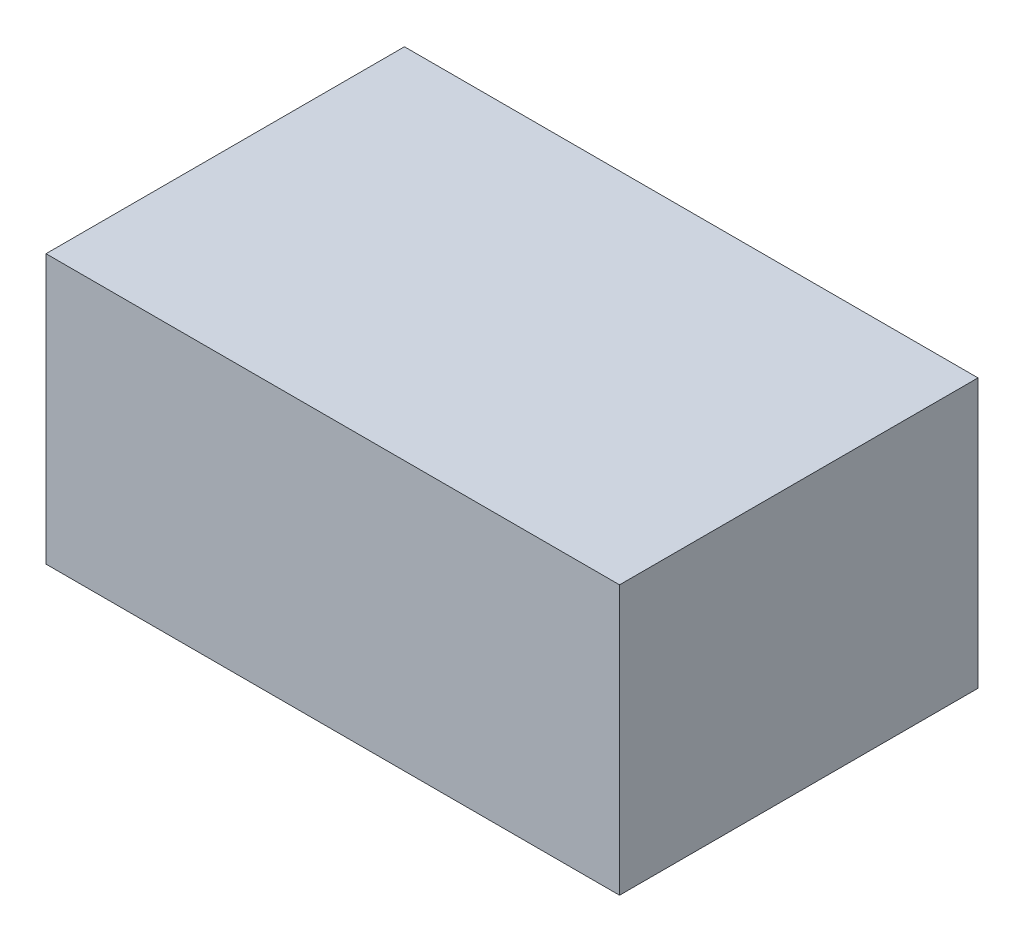
ISO-10303-21;
HEADER;
FILE_DESCRIPTION(('STEP AP214'),'2;1');
FILE_NAME('part.step','',(''),(''),'','','');
FILE_SCHEMA(('AUTOMOTIVE_DESIGN { 1 0 10303 214 1 1 1 1 }'));
ENDSEC;
DATA;
#1=APPLICATION_CONTEXT('core data for automotive mechanical design processes');
#2=APPLICATION_PROTOCOL_DEFINITION('international standard','automotive_design',2000,#1);
#3=PRODUCT_CONTEXT('',#1,'mechanical');
#4=PRODUCT('Part','Part','',(#3));
#5=PRODUCT_RELATED_PRODUCT_CATEGORY('part','',(#4));
#6=PRODUCT_DEFINITION_FORMATION('','',#4);
#7=PRODUCT_DEFINITION_CONTEXT('part definition',#1,'design');
#8=PRODUCT_DEFINITION('design','',#6,#7);
#9=PRODUCT_DEFINITION_SHAPE('','',#8);
#10=(LENGTH_UNIT() NAMED_UNIT(*) SI_UNIT(.MILLI.,.METRE.));
#11=(NAMED_UNIT(*) PLANE_ANGLE_UNIT() SI_UNIT($,.RADIAN.));
#12=(NAMED_UNIT(*) SI_UNIT($,.STERADIAN.) SOLID_ANGLE_UNIT());
#13=UNCERTAINTY_MEASURE_WITH_UNIT(LENGTH_MEASURE(1.E-05),#10,'distance_accuracy_value','');
#14=(GEOMETRIC_REPRESENTATION_CONTEXT(3) GLOBAL_UNCERTAINTY_ASSIGNED_CONTEXT((#13)) GLOBAL_UNIT_ASSIGNED_CONTEXT((#10,
#11,#12)) REPRESENTATION_CONTEXT('',''));
#15=CARTESIAN_POINT('',(0.,0.,0.));
#16=DIRECTION('',(0.,0.,1.));
#17=DIRECTION('',(1.,0.,0.));
#18=AXIS2_PLACEMENT_3D('',#15,#16,#17);
#19=CARTESIAN_POINT('',(-109.830508474576,150.,-94.2372881355932));
#20=DIRECTION('',(1.,0.,0.));
#21=DIRECTION('',(0.,0.,-1.));
#22=AXIS2_PLACEMENT_3D('',#19,#20,#21);
#23=PLANE('',#22);
#24=DIRECTION('',(0.,0.,1.));
#25=VECTOR('',#24,1.);
#26=CARTESIAN_POINT('',(-109.830508474576,0.,-94.2372881355932));
#27=LINE('',#26,#25);
#28=CARTESIAN_POINT('',(-109.830508474576,0.,-94.2372881355932));
#29=VERTEX_POINT('',#28);
#30=CARTESIAN_POINT('',(-109.830508474576,0.,105.762711864407));
#31=VERTEX_POINT('',#30);
#32=EDGE_CURVE('E140',#29,#31,#27,.T.);
#33=ORIENTED_EDGE('',*,*,#32,.T.);
#34=DIRECTION('',(0.,-1.,0.));
#35=VECTOR('',#34,1.);
#36=CARTESIAN_POINT('',(-109.830508474576,150.,105.762711864407));
#37=LINE('',#36,#35);
#38=CARTESIAN_POINT('',(-109.830508474576,150.,105.762711864407));
#39=VERTEX_POINT('',#38);
#40=EDGE_CURVE('E131',#39,#31,#37,.T.);
#41=ORIENTED_EDGE('',*,*,#40,.F.);
#42=DIRECTION('',(0.,0.,1.));
#43=VECTOR('',#42,1.);
#44=CARTESIAN_POINT('',(-109.830508474576,150.,-94.2372881355932));
#45=LINE('',#44,#43);
#46=CARTESIAN_POINT('',(-109.830508474576,150.,-94.2372881355932));
#47=VERTEX_POINT('',#46);
#48=EDGE_CURVE('E125',#47,#39,#45,.T.);
#49=ORIENTED_EDGE('',*,*,#48,.F.);
#50=DIRECTION('',(0.,-1.,0.));
#51=VECTOR('',#50,1.);
#52=CARTESIAN_POINT('',(-109.830508474576,150.,-94.2372881355932));
#53=LINE('',#52,#51);
#54=EDGE_CURVE('E136',#47,#29,#53,.T.);
#55=ORIENTED_EDGE('',*,*,#54,.T.);
#56=EDGE_LOOP('',(#33,#41,#49,#55));
#57=FACE_BOUND('',#56,.T.);
#58=ADVANCED_FACE('F34',(#57),#23,.F.);
#59=CARTESIAN_POINT('',(-109.830508474576,150.,105.762711864407));
#60=DIRECTION('',(0.,0.,-1.));
#61=DIRECTION('',(-1.,0.,0.));
#62=AXIS2_PLACEMENT_3D('',#59,#60,#61);
#63=PLANE('',#62);
#64=DIRECTION('',(1.,0.,0.));
#65=VECTOR('',#64,1.);
#66=CARTESIAN_POINT('',(-109.830508474576,0.,105.762711864407));
#67=LINE('',#66,#65);
#68=CARTESIAN_POINT('',(210.169491525424,0.,105.762711864407));
#69=VERTEX_POINT('',#68);
#70=EDGE_CURVE('E130',#31,#69,#67,.T.);
#71=ORIENTED_EDGE('',*,*,#70,.T.);
#72=DIRECTION('',(0.,-1.,0.));
#73=VECTOR('',#72,1.);
#74=CARTESIAN_POINT('',(210.169491525424,150.,105.762711864407));
#75=LINE('',#74,#73);
#76=CARTESIAN_POINT('',(210.169491525424,150.,105.762711864407));
#77=VERTEX_POINT('',#76);
#78=EDGE_CURVE('E128',#77,#69,#75,.T.);
#79=ORIENTED_EDGE('',*,*,#78,.F.);
#80=DIRECTION('',(1.,0.,0.));
#81=VECTOR('',#80,1.);
#82=CARTESIAN_POINT('',(-109.830508474576,150.,105.762711864407));
#83=LINE('',#82,#81);
#84=EDGE_CURVE('E120',#39,#77,#83,.T.);
#85=ORIENTED_EDGE('',*,*,#84,.F.);
#86=ORIENTED_EDGE('',*,*,#40,.T.);
#87=EDGE_LOOP('',(#71,#79,#85,#86));
#88=FACE_BOUND('',#87,.T.);
#89=ADVANCED_FACE('F129',(#88),#63,.F.);
#90=CARTESIAN_POINT('',(210.169491525424,150.,-94.2372881355932));
#91=DIRECTION('',(-1.,0.,0.));
#92=DIRECTION('',(0.,0.,1.));
#93=AXIS2_PLACEMENT_3D('',#90,#91,#92);
#94=PLANE('',#93);
#95=DIRECTION('',(0.,0.,-1.));
#96=VECTOR('',#95,1.);
#97=CARTESIAN_POINT('',(210.169491525424,0.,-94.2372881355932));
#98=LINE('',#97,#96);
#99=CARTESIAN_POINT('',(210.169491525424,0.,-94.2372881355932));
#100=VERTEX_POINT('',#99);
#101=EDGE_CURVE('E106',#69,#100,#98,.T.);
#102=ORIENTED_EDGE('',*,*,#101,.T.);
#103=DIRECTION('',(0.,-1.,0.));
#104=VECTOR('',#103,1.);
#105=CARTESIAN_POINT('',(210.169491525424,150.,-94.2372881355932));
#106=LINE('',#105,#104);
#107=CARTESIAN_POINT('',(210.169491525424,150.,-94.2372881355932));
#108=VERTEX_POINT('',#107);
#109=EDGE_CURVE('E132',#108,#100,#106,.T.);
#110=ORIENTED_EDGE('',*,*,#109,.F.);
#111=DIRECTION('',(0.,0.,-1.));
#112=VECTOR('',#111,1.);
#113=CARTESIAN_POINT('',(210.169491525424,150.,-94.2372881355932));
#114=LINE('',#113,#112);
#115=EDGE_CURVE('E123',#77,#108,#114,.T.);
#116=ORIENTED_EDGE('',*,*,#115,.F.);
#117=ORIENTED_EDGE('',*,*,#78,.T.);
#118=EDGE_LOOP('',(#102,#110,#116,#117));
#119=FACE_BOUND('',#118,.T.);
#120=ADVANCED_FACE('F134',(#119),#94,.F.);
#121=CARTESIAN_POINT('',(-109.830508474576,150.,-94.2372881355932));
#122=DIRECTION('',(0.,0.,1.));
#123=DIRECTION('',(1.,0.,0.));
#124=AXIS2_PLACEMENT_3D('',#121,#122,#123);
#125=PLANE('',#124);
#126=DIRECTION('',(-1.,0.,0.));
#127=VECTOR('',#126,1.);
#128=CARTESIAN_POINT('',(-109.830508474576,0.,-94.2372881355932));
#129=LINE('',#128,#127);
#130=EDGE_CURVE('E112',#100,#29,#129,.T.);
#131=ORIENTED_EDGE('',*,*,#130,.T.);
#132=ORIENTED_EDGE('',*,*,#54,.F.);
#133=DIRECTION('',(-1.,0.,0.));
#134=VECTOR('',#133,1.);
#135=CARTESIAN_POINT('',(-109.830508474576,150.,-94.2372881355932));
#136=LINE('',#135,#134);
#137=EDGE_CURVE('E89',#108,#47,#136,.T.);
#138=ORIENTED_EDGE('',*,*,#137,.F.);
#139=ORIENTED_EDGE('',*,*,#109,.T.);
#140=EDGE_LOOP('',(#131,#132,#138,#139));
#141=FACE_BOUND('',#140,.T.);
#142=ADVANCED_FACE('F204',(#141),#125,.F.);
#143=CARTESIAN_POINT('',(0.,150.,0.));
#144=DIRECTION('',(0.,1.,0.));
#145=DIRECTION('',(0.,0.,1.));
#146=AXIS2_PLACEMENT_3D('',#143,#144,#145);
#147=PLANE('',#146);
#148=ORIENTED_EDGE('',*,*,#48,.T.);
#149=ORIENTED_EDGE('',*,*,#84,.T.);
#150=ORIENTED_EDGE('',*,*,#115,.T.);
#151=ORIENTED_EDGE('',*,*,#137,.T.);
#152=EDGE_LOOP('',(#148,#149,#150,#151));
#153=FACE_BOUND('',#152,.T.);
#154=ADVANCED_FACE('F121',(#153),#147,.T.);
#155=CARTESIAN_POINT('',(0.,0.,0.));
#156=DIRECTION('',(0.,1.,0.));
#157=DIRECTION('',(0.,0.,1.));
#158=AXIS2_PLACEMENT_3D('',#155,#156,#157);
#159=PLANE('',#158);
#160=ORIENTED_EDGE('',*,*,#32,.F.);
#161=ORIENTED_EDGE('',*,*,#130,.F.);
#162=ORIENTED_EDGE('',*,*,#101,.F.);
#163=ORIENTED_EDGE('',*,*,#70,.F.);
#164=EDGE_LOOP('',(#160,#161,#162,#163));
#165=FACE_BOUND('',#164,.T.);
#166=ADVANCED_FACE('F207',(#165),#159,.F.);
#167=CLOSED_SHELL('',(#58,#89,#120,#142,#154,#166));
#168=CARTESIAN_POINT('',(-106.830508474576,150.,-94.2372881355932));
#169=DIRECTION('',(1.,0.,0.));
#170=DIRECTION('',(0.,0.,-1.));
#171=AXIS2_PLACEMENT_3D('',#168,#169,#170);
#172=PLANE('',#171);
#173=DIRECTION('',(0.,0.,1.));
#174=VECTOR('',#173,1.);
#175=CARTESIAN_POINT('',(-106.830508474576,3.,-94.2372881355932));
#176=LINE('',#175,#174);
#177=CARTESIAN_POINT('',(-106.830508474576,3.,-91.2372881355932));
#178=VERTEX_POINT('',#177);
#179=CARTESIAN_POINT('',(-106.830508474576,3.,102.762711864407));
#180=VERTEX_POINT('',#179);
#181=EDGE_CURVE('E38',#178,#180,#176,.T.);
#182=ORIENTED_EDGE('',*,*,#181,.F.);
#183=DIRECTION('',(0.,-1.,0.));
#184=VECTOR('',#183,1.);
#185=CARTESIAN_POINT('',(-106.830508474576,150.,-91.2372881355932));
#186=LINE('',#185,#184);
#187=CARTESIAN_POINT('',(-106.830508474576,147.,-91.2372881355932));
#188=VERTEX_POINT('',#187);
#189=EDGE_CURVE('E164',#188,#178,#186,.T.);
#190=ORIENTED_EDGE('',*,*,#189,.F.);
#191=DIRECTION('',(0.,0.,1.));
#192=VECTOR('',#191,1.);
#193=CARTESIAN_POINT('',(-106.830508474576,147.,-94.2372881355932));
#194=LINE('',#193,#192);
#195=CARTESIAN_POINT('',(-106.830508474576,147.,102.762711864407));
#196=VERTEX_POINT('',#195);
#197=EDGE_CURVE('E151',#188,#196,#194,.T.);
#198=ORIENTED_EDGE('',*,*,#197,.T.);
#199=DIRECTION('',(0.,-1.,0.));
#200=VECTOR('',#199,1.);
#201=CARTESIAN_POINT('',(-106.830508474576,150.,102.762711864407));
#202=LINE('',#201,#200);
#203=EDGE_CURVE('E162',#196,#180,#202,.T.);
#204=ORIENTED_EDGE('',*,*,#203,.T.);
#205=EDGE_LOOP('',(#182,#190,#198,#204));
#206=FACE_BOUND('',#205,.T.);
#207=ADVANCED_FACE('F171',(#206),#172,.T.);
#208=CARTESIAN_POINT('',(-109.830508474576,150.,102.762711864407));
#209=DIRECTION('',(0.,0.,-1.));
#210=DIRECTION('',(-1.,0.,0.));
#211=AXIS2_PLACEMENT_3D('',#208,#209,#210);
#212=PLANE('',#211);
#213=DIRECTION('',(1.,0.,0.));
#214=VECTOR('',#213,1.);
#215=CARTESIAN_POINT('',(-109.830508474576,3.,102.762711864407));
#216=LINE('',#215,#214);
#217=CARTESIAN_POINT('',(207.169491525424,3.,102.762711864407));
#218=VERTEX_POINT('',#217);
#219=EDGE_CURVE('E54',#180,#218,#216,.T.);
#220=ORIENTED_EDGE('',*,*,#219,.F.);
#221=ORIENTED_EDGE('',*,*,#203,.F.);
#222=DIRECTION('',(1.,0.,0.));
#223=VECTOR('',#222,1.);
#224=CARTESIAN_POINT('',(-109.830508474576,147.,102.762711864407));
#225=LINE('',#224,#223);
#226=CARTESIAN_POINT('',(207.169491525424,147.,102.762711864407));
#227=VERTEX_POINT('',#226);
#228=EDGE_CURVE('E77',#196,#227,#225,.T.);
#229=ORIENTED_EDGE('',*,*,#228,.T.);
#230=DIRECTION('',(0.,-1.,0.));
#231=VECTOR('',#230,1.);
#232=CARTESIAN_POINT('',(207.169491525424,150.,102.762711864407));
#233=LINE('',#232,#231);
#234=EDGE_CURVE('E158',#227,#218,#233,.T.);
#235=ORIENTED_EDGE('',*,*,#234,.T.);
#236=EDGE_LOOP('',(#220,#221,#229,#235));
#237=FACE_BOUND('',#236,.T.);
#238=ADVANCED_FACE('F172',(#237),#212,.T.);
#239=CARTESIAN_POINT('',(207.169491525424,150.,-94.2372881355932));
#240=DIRECTION('',(-1.,0.,0.));
#241=DIRECTION('',(0.,0.,1.));
#242=AXIS2_PLACEMENT_3D('',#239,#240,#241);
#243=PLANE('',#242);
#244=DIRECTION('',(0.,0.,-1.));
#245=VECTOR('',#244,1.);
#246=CARTESIAN_POINT('',(207.169491525424,3.,-94.2372881355932));
#247=LINE('',#246,#245);
#248=CARTESIAN_POINT('',(207.169491525424,3.,-91.2372881355932));
#249=VERTEX_POINT('',#248);
#250=EDGE_CURVE('E160',#218,#249,#247,.T.);
#251=ORIENTED_EDGE('',*,*,#250,.F.);
#252=ORIENTED_EDGE('',*,*,#234,.F.);
#253=DIRECTION('',(0.,0.,-1.));
#254=VECTOR('',#253,1.);
#255=CARTESIAN_POINT('',(207.169491525424,147.,-94.2372881355932));
#256=LINE('',#255,#254);
#257=CARTESIAN_POINT('',(207.169491525424,147.,-91.2372881355932));
#258=VERTEX_POINT('',#257);
#259=EDGE_CURVE('E45',#227,#258,#256,.T.);
#260=ORIENTED_EDGE('',*,*,#259,.T.);
#261=DIRECTION('',(0.,-1.,0.));
#262=VECTOR('',#261,1.);
#263=CARTESIAN_POINT('',(207.169491525424,150.,-91.2372881355932));
#264=LINE('',#263,#262);
#265=EDGE_CURVE('E153',#258,#249,#264,.T.);
#266=ORIENTED_EDGE('',*,*,#265,.T.);
#267=EDGE_LOOP('',(#251,#252,#260,#266));
#268=FACE_BOUND('',#267,.T.);
#269=ADVANCED_FACE('F176',(#268),#243,.T.);
#270=CARTESIAN_POINT('',(-109.830508474576,150.,-91.2372881355932));
#271=DIRECTION('',(0.,0.,1.));
#272=DIRECTION('',(1.,0.,0.));
#273=AXIS2_PLACEMENT_3D('',#270,#271,#272);
#274=PLANE('',#273);
#275=DIRECTION('',(-1.,0.,0.));
#276=VECTOR('',#275,1.);
#277=CARTESIAN_POINT('',(-109.830508474576,3.,-91.2372881355932));
#278=LINE('',#277,#276);
#279=EDGE_CURVE('E156',#249,#178,#278,.T.);
#280=ORIENTED_EDGE('',*,*,#279,.F.);
#281=ORIENTED_EDGE('',*,*,#265,.F.);
#282=DIRECTION('',(-1.,0.,0.));
#283=VECTOR('',#282,1.);
#284=CARTESIAN_POINT('',(-109.830508474576,147.,-91.2372881355932));
#285=LINE('',#284,#283);
#286=EDGE_CURVE('E11',#258,#188,#285,.T.);
#287=ORIENTED_EDGE('',*,*,#286,.T.);
#288=ORIENTED_EDGE('',*,*,#189,.T.);
#289=EDGE_LOOP('',(#280,#281,#287,#288));
#290=FACE_BOUND('',#289,.T.);
#291=ADVANCED_FACE('F180',(#290),#274,.T.);
#292=CARTESIAN_POINT('',(0.,147.,0.));
#293=DIRECTION('',(0.,1.,0.));
#294=DIRECTION('',(0.,0.,1.));
#295=AXIS2_PLACEMENT_3D('',#292,#293,#294);
#296=PLANE('',#295);
#297=ORIENTED_EDGE('',*,*,#197,.F.);
#298=ORIENTED_EDGE('',*,*,#286,.F.);
#299=ORIENTED_EDGE('',*,*,#259,.F.);
#300=ORIENTED_EDGE('',*,*,#228,.F.);
#301=EDGE_LOOP('',(#297,#298,#299,#300));
#302=FACE_BOUND('',#301,.T.);
#303=ADVANCED_FACE('F179',(#302),#296,.F.);
#304=CARTESIAN_POINT('',(0.,3.,0.));
#305=DIRECTION('',(0.,1.,0.));
#306=DIRECTION('',(0.,0.,1.));
#307=AXIS2_PLACEMENT_3D('',#304,#305,#306);
#308=PLANE('',#307);
#309=ORIENTED_EDGE('',*,*,#181,.T.);
#310=ORIENTED_EDGE('',*,*,#219,.T.);
#311=ORIENTED_EDGE('',*,*,#250,.T.);
#312=ORIENTED_EDGE('',*,*,#279,.T.);
#313=EDGE_LOOP('',(#309,#310,#311,#312));
#314=FACE_BOUND('',#313,.T.);
#315=ADVANCED_FACE('F36',(#314),#308,.T.);
#316=CLOSED_SHELL('',(#207,#238,#269,#291,#303,#315));
#317=ORIENTED_CLOSED_SHELL('',*,#316,.T.);
#318=BREP_WITH_VOIDS('B2',#167,(#317));
#319=ADVANCED_BREP_SHAPE_REPRESENTATION('',(#18,#318),#14);
#320=SHAPE_DEFINITION_REPRESENTATION(#9,#319);
ENDSEC;
END-ISO-10303-21;
